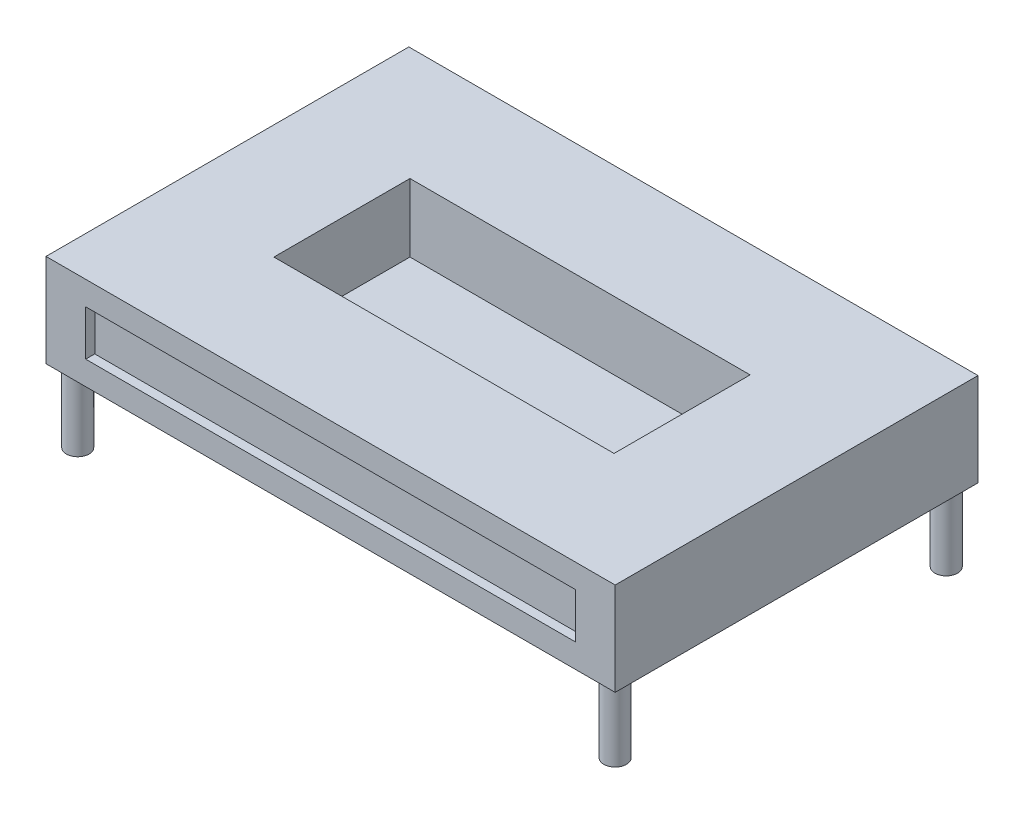
ISO-10303-21;
HEADER;
FILE_DESCRIPTION(('STEP AP214'),'2;1');
FILE_NAME('part.step','',(''),(''),'','','');
FILE_SCHEMA(('AUTOMOTIVE_DESIGN { 1 0 10303 214 1 1 1 1 }'));
ENDSEC;
DATA;
#1=APPLICATION_CONTEXT('core data for automotive mechanical design processes');
#2=APPLICATION_PROTOCOL_DEFINITION('international standard','automotive_design',2000,#1);
#3=PRODUCT_CONTEXT('',#1,'mechanical');
#4=PRODUCT('Part','Part','',(#3));
#5=PRODUCT_RELATED_PRODUCT_CATEGORY('part','',(#4));
#6=PRODUCT_DEFINITION_FORMATION('','',#4);
#7=PRODUCT_DEFINITION_CONTEXT('part definition',#1,'design');
#8=PRODUCT_DEFINITION('design','',#6,#7);
#9=PRODUCT_DEFINITION_SHAPE('','',#8);
#10=(LENGTH_UNIT() NAMED_UNIT(*) SI_UNIT(.MILLI.,.METRE.));
#11=(NAMED_UNIT(*) PLANE_ANGLE_UNIT() SI_UNIT($,.RADIAN.));
#12=(NAMED_UNIT(*) SI_UNIT($,.STERADIAN.) SOLID_ANGLE_UNIT());
#13=UNCERTAINTY_MEASURE_WITH_UNIT(LENGTH_MEASURE(1.E-05),#10,'distance_accuracy_value','');
#14=(GEOMETRIC_REPRESENTATION_CONTEXT(3) GLOBAL_UNCERTAINTY_ASSIGNED_CONTEXT((#13)) GLOBAL_UNIT_ASSIGNED_CONTEXT((#10,
#11,#12)) REPRESENTATION_CONTEXT('',''));
#15=CARTESIAN_POINT('',(0.,0.,0.));
#16=DIRECTION('',(0.,0.,1.));
#17=DIRECTION('',(1.,0.,0.));
#18=AXIS2_PLACEMENT_3D('',#15,#16,#17);
#19=CARTESIAN_POINT('',(-62.75,10.25,-40.));
#20=DIRECTION('',(0.,0.,1.));
#21=DIRECTION('',(1.,0.,0.));
#22=AXIS2_PLACEMENT_3D('',#19,#20,#21);
#23=PLANE('',#22);
#24=DIRECTION('',(-1.,0.,0.));
#25=VECTOR('',#24,1.);
#26=CARTESIAN_POINT('',(-62.75,-10.25,-40.));
#27=LINE('',#26,#25);
#28=CARTESIAN_POINT('',(62.75,-10.25,-40.));
#29=VERTEX_POINT('',#28);
#30=CARTESIAN_POINT('',(-62.75,-10.25,-40.));
#31=VERTEX_POINT('',#30);
#32=EDGE_CURVE('E337',#29,#31,#27,.T.);
#33=ORIENTED_EDGE('',*,*,#32,.T.);
#34=DIRECTION('',(0.,-1.,0.));
#35=VECTOR('',#34,1.);
#36=CARTESIAN_POINT('',(-62.75,10.25,-40.));
#37=LINE('',#36,#35);
#38=CARTESIAN_POINT('',(-62.75,10.25,-40.));
#39=VERTEX_POINT('',#38);
#40=EDGE_CURVE('E352',#39,#31,#37,.T.);
#41=ORIENTED_EDGE('',*,*,#40,.F.);
#42=DIRECTION('',(-1.,0.,0.));
#43=VECTOR('',#42,1.);
#44=CARTESIAN_POINT('',(-62.75,10.25,-40.));
#45=LINE('',#44,#43);
#46=CARTESIAN_POINT('',(62.75,10.25,-40.));
#47=VERTEX_POINT('',#46);
#48=EDGE_CURVE('E323',#47,#39,#45,.T.);
#49=ORIENTED_EDGE('',*,*,#48,.F.);
#50=DIRECTION('',(0.,-1.,0.));
#51=VECTOR('',#50,1.);
#52=CARTESIAN_POINT('',(62.75,10.25,-40.));
#53=LINE('',#52,#51);
#54=EDGE_CURVE('E356',#47,#29,#53,.T.);
#55=ORIENTED_EDGE('',*,*,#54,.T.);
#56=EDGE_LOOP('',(#33,#41,#49,#55));
#57=FACE_BOUND('',#56,.T.);
#58=DIRECTION('',(0.,1.,0.));
#59=VECTOR('',#58,1.);
#60=CARTESIAN_POINT('',(54.,-5.,-40.));
#61=LINE('',#60,#59);
#62=CARTESIAN_POINT('',(54.,-5.,-40.));
#63=VERTEX_POINT('',#62);
#64=CARTESIAN_POINT('',(54.,5.,-40.));
#65=VERTEX_POINT('',#64);
#66=EDGE_CURVE('E60',#63,#65,#61,.T.);
#67=ORIENTED_EDGE('',*,*,#66,.T.);
#68=DIRECTION('',(-1.,0.,0.));
#69=VECTOR('',#68,1.);
#70=CARTESIAN_POINT('',(-54.,5.,-40.));
#71=LINE('',#70,#69);
#72=CARTESIAN_POINT('',(-54.,5.,-40.));
#73=VERTEX_POINT('',#72);
#74=EDGE_CURVE('E181',#65,#73,#71,.T.);
#75=ORIENTED_EDGE('',*,*,#74,.T.);
#76=DIRECTION('',(0.,-1.,0.));
#77=VECTOR('',#76,1.);
#78=CARTESIAN_POINT('',(-54.,-5.,-40.));
#79=LINE('',#78,#77);
#80=CARTESIAN_POINT('',(-54.,-5.,-40.));
#81=VERTEX_POINT('',#80);
#82=EDGE_CURVE('E185',#73,#81,#79,.T.);
#83=ORIENTED_EDGE('',*,*,#82,.T.);
#84=DIRECTION('',(1.,0.,0.));
#85=VECTOR('',#84,1.);
#86=CARTESIAN_POINT('',(-54.,-5.,-40.));
#87=LINE('',#86,#85);
#88=EDGE_CURVE('E194',#81,#63,#87,.T.);
#89=ORIENTED_EDGE('',*,*,#88,.T.);
#90=EDGE_LOOP('',(#67,#75,#83,#89));
#91=FACE_BOUND('',#90,.T.);
#92=ADVANCED_FACE('F44',(#57,#91),#23,.F.);
#93=CARTESIAN_POINT('',(62.75,10.25,40.));
#94=DIRECTION('',(-1.,0.,0.));
#95=DIRECTION('',(0.,0.,1.));
#96=AXIS2_PLACEMENT_3D('',#93,#94,#95);
#97=PLANE('',#96);
#98=DIRECTION('',(0.,0.,-1.));
#99=VECTOR('',#98,1.);
#100=CARTESIAN_POINT('',(62.75,-10.25,40.));
#101=LINE('',#100,#99);
#102=CARTESIAN_POINT('',(62.75,-10.25,40.));
#103=VERTEX_POINT('',#102);
#104=EDGE_CURVE('E309',#103,#29,#101,.T.);
#105=ORIENTED_EDGE('',*,*,#104,.T.);
#106=ORIENTED_EDGE('',*,*,#54,.F.);
#107=DIRECTION('',(0.,0.,-1.));
#108=VECTOR('',#107,1.);
#109=CARTESIAN_POINT('',(62.75,10.25,40.));
#110=LINE('',#109,#108);
#111=CARTESIAN_POINT('',(62.75,10.25,40.));
#112=VERTEX_POINT('',#111);
#113=EDGE_CURVE('E319',#112,#47,#110,.T.);
#114=ORIENTED_EDGE('',*,*,#113,.F.);
#115=DIRECTION('',(0.,-1.,0.));
#116=VECTOR('',#115,1.);
#117=CARTESIAN_POINT('',(62.75,10.25,40.));
#118=LINE('',#117,#116);
#119=EDGE_CURVE('E333',#112,#103,#118,.T.);
#120=ORIENTED_EDGE('',*,*,#119,.T.);
#121=EDGE_LOOP('',(#105,#106,#114,#120));
#122=FACE_BOUND('',#121,.T.);
#123=ADVANCED_FACE('F46',(#122),#97,.F.);
#124=CARTESIAN_POINT('',(-62.75,10.25,40.));
#125=DIRECTION('',(1.,0.,0.));
#126=DIRECTION('',(0.,0.,-1.));
#127=AXIS2_PLACEMENT_3D('',#124,#125,#126);
#128=PLANE('',#127);
#129=DIRECTION('',(0.,0.,1.));
#130=VECTOR('',#129,1.);
#131=CARTESIAN_POINT('',(-62.75,-10.25,40.));
#132=LINE('',#131,#130);
#133=CARTESIAN_POINT('',(-62.75,-10.25,40.));
#134=VERTEX_POINT('',#133);
#135=EDGE_CURVE('E340',#31,#134,#132,.T.);
#136=ORIENTED_EDGE('',*,*,#135,.T.);
#137=DIRECTION('',(0.,-1.,0.));
#138=VECTOR('',#137,1.);
#139=CARTESIAN_POINT('',(-62.75,10.25,40.));
#140=LINE('',#139,#138);
#141=CARTESIAN_POINT('',(-62.75,10.25,40.));
#142=VERTEX_POINT('',#141);
#143=EDGE_CURVE('E348',#142,#134,#140,.T.);
#144=ORIENTED_EDGE('',*,*,#143,.F.);
#145=DIRECTION('',(0.,0.,1.));
#146=VECTOR('',#145,1.);
#147=CARTESIAN_POINT('',(-62.75,10.25,40.));
#148=LINE('',#147,#146);
#149=EDGE_CURVE('E327',#39,#142,#148,.T.);
#150=ORIENTED_EDGE('',*,*,#149,.F.);
#151=ORIENTED_EDGE('',*,*,#40,.T.);
#152=EDGE_LOOP('',(#136,#144,#150,#151));
#153=FACE_BOUND('',#152,.T.);
#154=ADVANCED_FACE('F387',(#153),#128,.F.);
#155=CARTESIAN_POINT('',(-62.75,10.25,40.));
#156=DIRECTION('',(0.,0.,-1.));
#157=DIRECTION('',(-1.,0.,0.));
#158=AXIS2_PLACEMENT_3D('',#155,#156,#157);
#159=PLANE('',#158);
#160=DIRECTION('',(-1.,0.,0.));
#161=VECTOR('',#160,1.);
#162=CARTESIAN_POINT('',(-54.,5.,40.));
#163=LINE('',#162,#161);
#164=CARTESIAN_POINT('',(54.,5.,40.));
#165=VERTEX_POINT('',#164);
#166=CARTESIAN_POINT('',(-54.,5.,40.));
#167=VERTEX_POINT('',#166);
#168=EDGE_CURVE('E228',#165,#167,#163,.T.);
#169=ORIENTED_EDGE('',*,*,#168,.F.);
#170=DIRECTION('',(0.,1.,0.));
#171=VECTOR('',#170,1.);
#172=CARTESIAN_POINT('',(54.,-5.,40.));
#173=LINE('',#172,#171);
#174=CARTESIAN_POINT('',(54.,-5.,40.));
#175=VERTEX_POINT('',#174);
#176=EDGE_CURVE('E68',#175,#165,#173,.T.);
#177=ORIENTED_EDGE('',*,*,#176,.F.);
#178=DIRECTION('',(1.,0.,0.));
#179=VECTOR('',#178,1.);
#180=CARTESIAN_POINT('',(-54.,-5.,40.));
#181=LINE('',#180,#179);
#182=CARTESIAN_POINT('',(-54.,-5.,40.));
#183=VERTEX_POINT('',#182);
#184=EDGE_CURVE('E213',#183,#175,#181,.T.);
#185=ORIENTED_EDGE('',*,*,#184,.F.);
#186=DIRECTION('',(0.,-1.,0.));
#187=VECTOR('',#186,1.);
#188=CARTESIAN_POINT('',(-54.,-5.,40.));
#189=LINE('',#188,#187);
#190=EDGE_CURVE('E232',#167,#183,#189,.T.);
#191=ORIENTED_EDGE('',*,*,#190,.F.);
#192=EDGE_LOOP('',(#169,#177,#185,#191));
#193=FACE_BOUND('',#192,.T.);
#194=DIRECTION('',(1.,0.,0.));
#195=VECTOR('',#194,1.);
#196=CARTESIAN_POINT('',(-62.75,-10.25,40.));
#197=LINE('',#196,#195);
#198=EDGE_CURVE('E324',#134,#103,#197,.T.);
#199=ORIENTED_EDGE('',*,*,#198,.T.);
#200=ORIENTED_EDGE('',*,*,#119,.F.);
#201=DIRECTION('',(1.,0.,0.));
#202=VECTOR('',#201,1.);
#203=CARTESIAN_POINT('',(-62.75,10.25,40.));
#204=LINE('',#203,#202);
#205=EDGE_CURVE('E330',#142,#112,#204,.T.);
#206=ORIENTED_EDGE('',*,*,#205,.F.);
#207=ORIENTED_EDGE('',*,*,#143,.T.);
#208=EDGE_LOOP('',(#199,#200,#206,#207));
#209=FACE_BOUND('',#208,.T.);
#210=ADVANCED_FACE('F383',(#193,#209),#159,.F.);
#211=CARTESIAN_POINT('',(0.,10.25,0.));
#212=DIRECTION('',(0.,-1.,0.));
#213=DIRECTION('',(0.,0.,-1.));
#214=AXIS2_PLACEMENT_3D('',#211,#212,#213);
#215=PLANE('',#214);
#216=DIRECTION('',(-1.,0.,0.));
#217=VECTOR('',#216,1.);
#218=CARTESIAN_POINT('',(-37.5,10.25,-15.));
#219=LINE('',#218,#217);
#220=CARTESIAN_POINT('',(37.5,10.25,-15.));
#221=VERTEX_POINT('',#220);
#222=CARTESIAN_POINT('',(-37.5,10.25,-15.));
#223=VERTEX_POINT('',#222);
#224=EDGE_CURVE('E295',#221,#223,#219,.T.);
#225=ORIENTED_EDGE('',*,*,#224,.F.);
#226=DIRECTION('',(0.,0.,-1.));
#227=VECTOR('',#226,1.);
#228=CARTESIAN_POINT('',(37.5,10.25,15.));
#229=LINE('',#228,#227);
#230=CARTESIAN_POINT('',(37.5,10.25,15.));
#231=VERTEX_POINT('',#230);
#232=EDGE_CURVE('E271',#231,#221,#229,.T.);
#233=ORIENTED_EDGE('',*,*,#232,.F.);
#234=DIRECTION('',(1.,0.,0.));
#235=VECTOR('',#234,1.);
#236=CARTESIAN_POINT('',(-37.5,10.25,15.));
#237=LINE('',#236,#235);
#238=CARTESIAN_POINT('',(-37.5,10.25,15.));
#239=VERTEX_POINT('',#238);
#240=EDGE_CURVE('E280',#239,#231,#237,.T.);
#241=ORIENTED_EDGE('',*,*,#240,.F.);
#242=DIRECTION('',(0.,0.,1.));
#243=VECTOR('',#242,1.);
#244=CARTESIAN_POINT('',(-37.5,10.25,15.));
#245=LINE('',#244,#243);
#246=EDGE_CURVE('E299',#223,#239,#245,.T.);
#247=ORIENTED_EDGE('',*,*,#246,.F.);
#248=EDGE_LOOP('',(#225,#233,#241,#247));
#249=FACE_BOUND('',#248,.T.);
#250=ORIENTED_EDGE('',*,*,#113,.T.);
#251=ORIENTED_EDGE('',*,*,#48,.T.);
#252=ORIENTED_EDGE('',*,*,#149,.T.);
#253=ORIENTED_EDGE('',*,*,#205,.T.);
#254=EDGE_LOOP('',(#250,#251,#252,#253));
#255=FACE_BOUND('',#254,.T.);
#256=ADVANCED_FACE('F369',(#249,#255),#215,.F.);
#257=CARTESIAN_POINT('',(0.,-10.25,0.));
#258=DIRECTION('',(0.,-1.,0.));
#259=DIRECTION('',(0.,0.,-1.));
#260=AXIS2_PLACEMENT_3D('',#257,#258,#259);
#261=PLANE('',#260);
#262=CARTESIAN_POINT('',(-59.25,-10.25,-36.5));
#263=DIRECTION('',(0.,-1.,0.));
#264=DIRECTION('',(0.,0.,1.));
#265=AXIS2_PLACEMENT_3D('',#262,#263,#264);
#266=CIRCLE('',#265,2.5);
#267=CARTESIAN_POINT('',(-59.25,-10.25,-34.));
#268=VERTEX_POINT('',#267);
#269=EDGE_CURVE('E242',#268,#268,#266,.T.);
#270=ORIENTED_EDGE('',*,*,#269,.F.);
#271=EDGE_LOOP('',(#270));
#272=FACE_BOUND('',#271,.T.);
#273=CARTESIAN_POINT('',(-59.25,-10.25,36.5));
#274=DIRECTION('',(0.,-1.,0.));
#275=DIRECTION('',(0.,0.,-1.));
#276=AXIS2_PLACEMENT_3D('',#273,#274,#275);
#277=CIRCLE('',#276,2.5);
#278=CARTESIAN_POINT('',(-59.25,-10.25,34.));
#279=VERTEX_POINT('',#278);
#280=EDGE_CURVE('E11',#279,#279,#277,.T.);
#281=ORIENTED_EDGE('',*,*,#280,.F.);
#282=EDGE_LOOP('',(#281));
#283=FACE_BOUND('',#282,.T.);
#284=CARTESIAN_POINT('',(59.25,-10.25,-36.5));
#285=DIRECTION('',(0.,-1.,0.));
#286=DIRECTION('',(0.,0.,-1.));
#287=AXIS2_PLACEMENT_3D('',#284,#285,#286);
#288=CIRCLE('',#287,2.5);
#289=CARTESIAN_POINT('',(59.25,-10.25,-39.));
#290=VERTEX_POINT('',#289);
#291=EDGE_CURVE('E53',#290,#290,#288,.T.);
#292=ORIENTED_EDGE('',*,*,#291,.F.);
#293=EDGE_LOOP('',(#292));
#294=FACE_BOUND('',#293,.T.);
#295=CARTESIAN_POINT('',(59.25,-10.25,36.5));
#296=DIRECTION('',(0.,-1.,0.));
#297=DIRECTION('',(0.,0.,-1.));
#298=AXIS2_PLACEMENT_3D('',#295,#296,#297);
#299=CIRCLE('',#298,2.5);
#300=CARTESIAN_POINT('',(59.25,-10.25,34.));
#301=VERTEX_POINT('',#300);
#302=EDGE_CURVE('E266',#301,#301,#299,.T.);
#303=ORIENTED_EDGE('',*,*,#302,.F.);
#304=EDGE_LOOP('',(#303));
#305=FACE_BOUND('',#304,.T.);
#306=ORIENTED_EDGE('',*,*,#104,.F.);
#307=ORIENTED_EDGE('',*,*,#198,.F.);
#308=ORIENTED_EDGE('',*,*,#135,.F.);
#309=ORIENTED_EDGE('',*,*,#32,.F.);
#310=EDGE_LOOP('',(#306,#307,#308,#309));
#311=FACE_BOUND('',#310,.T.);
#312=ADVANCED_FACE('F365',(#272,#283,#294,#305,#311),#261,.T.);
#313=CARTESIAN_POINT('',(37.5,-4.75,15.));
#314=DIRECTION('',(1.,0.,0.));
#315=DIRECTION('',(0.,0.,-1.));
#316=AXIS2_PLACEMENT_3D('',#313,#314,#315);
#317=PLANE('',#316);
#318=ORIENTED_EDGE('',*,*,#232,.T.);
#319=DIRECTION('',(0.,1.,0.));
#320=VECTOR('',#319,1.);
#321=CARTESIAN_POINT('',(37.5,-4.75,-15.));
#322=LINE('',#321,#320);
#323=CARTESIAN_POINT('',(37.5,-4.75,-15.));
#324=VERTEX_POINT('',#323);
#325=EDGE_CURVE('E292',#324,#221,#322,.T.);
#326=ORIENTED_EDGE('',*,*,#325,.F.);
#327=DIRECTION('',(0.,0.,-1.));
#328=VECTOR('',#327,1.);
#329=CARTESIAN_POINT('',(37.5,-4.75,15.));
#330=LINE('',#329,#328);
#331=CARTESIAN_POINT('',(37.5,-4.75,15.));
#332=VERTEX_POINT('',#331);
#333=EDGE_CURVE('E275',#332,#324,#330,.T.);
#334=ORIENTED_EDGE('',*,*,#333,.F.);
#335=DIRECTION('',(0.,1.,0.));
#336=VECTOR('',#335,1.);
#337=CARTESIAN_POINT('',(37.5,-4.75,15.));
#338=LINE('',#337,#336);
#339=EDGE_CURVE('E306',#332,#231,#338,.T.);
#340=ORIENTED_EDGE('',*,*,#339,.T.);
#341=EDGE_LOOP('',(#318,#326,#334,#340));
#342=FACE_BOUND('',#341,.T.);
#343=ADVANCED_FACE('F368',(#342),#317,.F.);
#344=CARTESIAN_POINT('',(-37.5,-4.75,15.));
#345=DIRECTION('',(0.,0.,1.));
#346=DIRECTION('',(1.,0.,0.));
#347=AXIS2_PLACEMENT_3D('',#344,#345,#346);
#348=PLANE('',#347);
#349=ORIENTED_EDGE('',*,*,#240,.T.);
#350=ORIENTED_EDGE('',*,*,#339,.F.);
#351=DIRECTION('',(1.,0.,0.));
#352=VECTOR('',#351,1.);
#353=CARTESIAN_POINT('',(-37.5,-4.75,15.));
#354=LINE('',#353,#352);
#355=CARTESIAN_POINT('',(-37.5,-4.75,15.));
#356=VERTEX_POINT('',#355);
#357=EDGE_CURVE('E288',#356,#332,#354,.T.);
#358=ORIENTED_EDGE('',*,*,#357,.F.);
#359=DIRECTION('',(0.,1.,0.));
#360=VECTOR('',#359,1.);
#361=CARTESIAN_POINT('',(-37.5,-4.75,15.));
#362=LINE('',#361,#360);
#363=EDGE_CURVE('E310',#356,#239,#362,.T.);
#364=ORIENTED_EDGE('',*,*,#363,.T.);
#365=EDGE_LOOP('',(#349,#350,#358,#364));
#366=FACE_BOUND('',#365,.T.);
#367=ADVANCED_FACE('F441',(#366),#348,.F.);
#368=CARTESIAN_POINT('',(-37.5,-4.75,15.));
#369=DIRECTION('',(-1.,0.,0.));
#370=DIRECTION('',(0.,0.,1.));
#371=AXIS2_PLACEMENT_3D('',#368,#369,#370);
#372=PLANE('',#371);
#373=ORIENTED_EDGE('',*,*,#246,.T.);
#374=ORIENTED_EDGE('',*,*,#363,.F.);
#375=DIRECTION('',(0.,0.,1.));
#376=VECTOR('',#375,1.);
#377=CARTESIAN_POINT('',(-37.5,-4.75,15.));
#378=LINE('',#377,#376);
#379=CARTESIAN_POINT('',(-37.5,-4.75,-15.));
#380=VERTEX_POINT('',#379);
#381=EDGE_CURVE('E284',#380,#356,#378,.T.);
#382=ORIENTED_EDGE('',*,*,#381,.F.);
#383=DIRECTION('',(0.,1.,0.));
#384=VECTOR('',#383,1.);
#385=CARTESIAN_POINT('',(-37.5,-4.75,-15.));
#386=LINE('',#385,#384);
#387=EDGE_CURVE('E313',#380,#223,#386,.T.);
#388=ORIENTED_EDGE('',*,*,#387,.T.);
#389=EDGE_LOOP('',(#373,#374,#382,#388));
#390=FACE_BOUND('',#389,.T.);
#391=ADVANCED_FACE('F449',(#390),#372,.F.);
#392=CARTESIAN_POINT('',(-37.5,-4.75,-15.));
#393=DIRECTION('',(0.,0.,-1.));
#394=DIRECTION('',(-1.,0.,0.));
#395=AXIS2_PLACEMENT_3D('',#392,#393,#394);
#396=PLANE('',#395);
#397=ORIENTED_EDGE('',*,*,#224,.T.);
#398=ORIENTED_EDGE('',*,*,#387,.F.);
#399=DIRECTION('',(-1.,0.,0.));
#400=VECTOR('',#399,1.);
#401=CARTESIAN_POINT('',(-37.5,-4.75,-15.));
#402=LINE('',#401,#400);
#403=EDGE_CURVE('E279',#324,#380,#402,.T.);
#404=ORIENTED_EDGE('',*,*,#403,.F.);
#405=ORIENTED_EDGE('',*,*,#325,.T.);
#406=EDGE_LOOP('',(#397,#398,#404,#405));
#407=FACE_BOUND('',#406,.T.);
#408=ADVANCED_FACE('F458',(#407),#396,.F.);
#409=CARTESIAN_POINT('',(0.,-4.75,0.));
#410=DIRECTION('',(0.,-1.,0.));
#411=DIRECTION('',(0.,0.,-1.));
#412=AXIS2_PLACEMENT_3D('',#409,#410,#411);
#413=PLANE('',#412);
#414=ORIENTED_EDGE('',*,*,#333,.T.);
#415=ORIENTED_EDGE('',*,*,#403,.T.);
#416=ORIENTED_EDGE('',*,*,#381,.T.);
#417=ORIENTED_EDGE('',*,*,#357,.T.);
#418=EDGE_LOOP('',(#414,#415,#416,#417));
#419=FACE_BOUND('',#418,.T.);
#420=ADVANCED_FACE('F467',(#419),#413,.F.);
#421=CARTESIAN_POINT('',(59.25,-26.25,36.5));
#422=DIRECTION('',(0.,1.,0.));
#423=DIRECTION('',(0.,0.,1.));
#424=AXIS2_PLACEMENT_3D('',#421,#422,#423);
#425=CYLINDRICAL_SURFACE('',#424,2.5);
#426=CARTESIAN_POINT('',(59.25,-26.25,36.5));
#427=DIRECTION('',(0.,-1.,0.));
#428=DIRECTION('',(0.,0.,-1.));
#429=AXIS2_PLACEMENT_3D('',#426,#427,#428);
#430=CIRCLE('',#429,2.5);
#431=CARTESIAN_POINT('',(59.25,-26.25,34.));
#432=VERTEX_POINT('',#431);
#433=EDGE_CURVE('E267',#432,#432,#430,.T.);
#434=ORIENTED_EDGE('',*,*,#433,.F.);
#435=EDGE_LOOP('',(#434));
#436=FACE_BOUND('',#435,.T.);
#437=ORIENTED_EDGE('',*,*,#302,.T.);
#438=EDGE_LOOP('',(#437));
#439=FACE_BOUND('',#438,.T.);
#440=ADVANCED_FACE('F476',(#436,#439),#425,.T.);
#441=CARTESIAN_POINT('',(59.25,-26.25,36.5));
#442=DIRECTION('',(0.,-1.,0.));
#443=DIRECTION('',(0.,0.,-1.));
#444=AXIS2_PLACEMENT_3D('',#441,#442,#443);
#445=PLANE('',#444);
#446=ORIENTED_EDGE('',*,*,#433,.T.);
#447=EDGE_LOOP('',(#446));
#448=FACE_BOUND('',#447,.T.);
#449=ADVANCED_FACE('F485',(#448),#445,.T.);
#450=CARTESIAN_POINT('',(59.25,-26.25,-36.5));
#451=DIRECTION('',(0.,1.,0.));
#452=DIRECTION('',(0.,0.,1.));
#453=AXIS2_PLACEMENT_3D('',#450,#451,#452);
#454=CYLINDRICAL_SURFACE('',#453,2.5);
#455=CARTESIAN_POINT('',(59.25,-26.25,-36.5));
#456=DIRECTION('',(0.,1.,0.));
#457=DIRECTION('',(0.,0.,1.));
#458=AXIS2_PLACEMENT_3D('',#455,#456,#457);
#459=CIRCLE('',#458,2.5);
#460=CARTESIAN_POINT('',(59.25,-26.25,-34.));
#461=VERTEX_POINT('',#460);
#462=EDGE_CURVE('E262',#461,#461,#459,.T.);
#463=ORIENTED_EDGE('',*,*,#462,.T.);
#464=EDGE_LOOP('',(#463));
#465=FACE_BOUND('',#464,.T.);
#466=ORIENTED_EDGE('',*,*,#291,.T.);
#467=EDGE_LOOP('',(#466));
#468=FACE_BOUND('',#467,.T.);
#469=ADVANCED_FACE('F363',(#465,#468),#454,.T.);
#470=CARTESIAN_POINT('',(59.25,-26.25,-36.5));
#471=DIRECTION('',(0.,-1.,0.));
#472=DIRECTION('',(0.,0.,1.));
#473=AXIS2_PLACEMENT_3D('',#470,#471,#472);
#474=PLANE('',#473);
#475=ORIENTED_EDGE('',*,*,#462,.F.);
#476=EDGE_LOOP('',(#475));
#477=FACE_BOUND('',#476,.T.);
#478=ADVANCED_FACE('F502',(#477),#474,.T.);
#479=CARTESIAN_POINT('',(-59.25,-26.25,36.5));
#480=DIRECTION('',(0.,1.,0.));
#481=DIRECTION('',(0.,0.,1.));
#482=AXIS2_PLACEMENT_3D('',#479,#480,#481);
#483=CYLINDRICAL_SURFACE('',#482,2.5);
#484=CARTESIAN_POINT('',(-59.25,-26.25,36.5));
#485=DIRECTION('',(0.,1.,0.));
#486=DIRECTION('',(0.,0.,-1.));
#487=AXIS2_PLACEMENT_3D('',#484,#485,#486);
#488=CIRCLE('',#487,2.5);
#489=CARTESIAN_POINT('',(-59.25,-26.25,34.));
#490=VERTEX_POINT('',#489);
#491=EDGE_CURVE('E255',#490,#490,#488,.T.);
#492=ORIENTED_EDGE('',*,*,#491,.T.);
#493=EDGE_LOOP('',(#492));
#494=FACE_BOUND('',#493,.T.);
#495=ORIENTED_EDGE('',*,*,#280,.T.);
#496=EDGE_LOOP('',(#495));
#497=FACE_BOUND('',#496,.T.);
#498=ADVANCED_FACE('F511',(#494,#497),#483,.T.);
#499=CARTESIAN_POINT('',(-59.25,-26.25,36.5));
#500=DIRECTION('',(0.,-1.,0.));
#501=DIRECTION('',(0.,0.,-1.));
#502=AXIS2_PLACEMENT_3D('',#499,#500,#501);
#503=PLANE('',#502);
#504=ORIENTED_EDGE('',*,*,#491,.F.);
#505=EDGE_LOOP('',(#504));
#506=FACE_BOUND('',#505,.T.);
#507=ADVANCED_FACE('F520',(#506),#503,.T.);
#508=CARTESIAN_POINT('',(-59.25,-26.25,-36.5));
#509=DIRECTION('',(0.,1.,0.));
#510=DIRECTION('',(0.,0.,1.));
#511=AXIS2_PLACEMENT_3D('',#508,#509,#510);
#512=CYLINDRICAL_SURFACE('',#511,2.5);
#513=CARTESIAN_POINT('',(-59.25,-26.25,-36.5));
#514=DIRECTION('',(0.,-1.,0.));
#515=DIRECTION('',(0.,0.,1.));
#516=AXIS2_PLACEMENT_3D('',#513,#514,#515);
#517=CIRCLE('',#516,2.5);
#518=CARTESIAN_POINT('',(-59.25,-26.25,-34.));
#519=VERTEX_POINT('',#518);
#520=EDGE_CURVE('E251',#519,#519,#517,.T.);
#521=ORIENTED_EDGE('',*,*,#520,.F.);
#522=EDGE_LOOP('',(#521));
#523=FACE_BOUND('',#522,.T.);
#524=ORIENTED_EDGE('',*,*,#269,.T.);
#525=EDGE_LOOP('',(#524));
#526=FACE_BOUND('',#525,.T.);
#527=ADVANCED_FACE('F529',(#523,#526),#512,.T.);
#528=CARTESIAN_POINT('',(-59.25,-26.25,-36.5));
#529=DIRECTION('',(0.,-1.,0.));
#530=DIRECTION('',(0.,0.,1.));
#531=AXIS2_PLACEMENT_3D('',#528,#529,#530);
#532=PLANE('',#531);
#533=ORIENTED_EDGE('',*,*,#520,.T.);
#534=EDGE_LOOP('',(#533));
#535=FACE_BOUND('',#534,.T.);
#536=ADVANCED_FACE('F538',(#535),#532,.T.);
#537=CARTESIAN_POINT('',(54.,-5.,38.));
#538=DIRECTION('',(1.,0.,0.));
#539=DIRECTION('',(0.,1.,0.));
#540=AXIS2_PLACEMENT_3D('',#537,#538,#539);
#541=PLANE('',#540);
#542=ORIENTED_EDGE('',*,*,#176,.T.);
#543=DIRECTION('',(0.,0.,1.));
#544=VECTOR('',#543,1.);
#545=CARTESIAN_POINT('',(54.,5.,38.));
#546=LINE('',#545,#544);
#547=CARTESIAN_POINT('',(54.,5.,38.));
#548=VERTEX_POINT('',#547);
#549=EDGE_CURVE('E225',#548,#165,#546,.T.);
#550=ORIENTED_EDGE('',*,*,#549,.F.);
#551=DIRECTION('',(0.,1.,0.));
#552=VECTOR('',#551,1.);
#553=CARTESIAN_POINT('',(54.,-5.,38.));
#554=LINE('',#553,#552);
#555=CARTESIAN_POINT('',(54.,-5.,38.));
#556=VERTEX_POINT('',#555);
#557=EDGE_CURVE('E208',#556,#548,#554,.T.);
#558=ORIENTED_EDGE('',*,*,#557,.F.);
#559=DIRECTION('',(0.,0.,1.));
#560=VECTOR('',#559,1.);
#561=CARTESIAN_POINT('',(54.,-5.,38.));
#562=LINE('',#561,#560);
#563=EDGE_CURVE('E239',#556,#175,#562,.T.);
#564=ORIENTED_EDGE('',*,*,#563,.T.);
#565=EDGE_LOOP('',(#542,#550,#558,#564));
#566=FACE_BOUND('',#565,.T.);
#567=ADVANCED_FACE('F547',(#566),#541,.F.);
#568=CARTESIAN_POINT('',(-54.,-5.,38.));
#569=DIRECTION('',(0.,-1.,0.));
#570=DIRECTION('',(0.,0.,-1.));
#571=AXIS2_PLACEMENT_3D('',#568,#569,#570);
#572=PLANE('',#571);
#573=ORIENTED_EDGE('',*,*,#184,.T.);
#574=ORIENTED_EDGE('',*,*,#563,.F.);
#575=DIRECTION('',(1.,0.,0.));
#576=VECTOR('',#575,1.);
#577=CARTESIAN_POINT('',(-54.,-5.,38.));
#578=LINE('',#577,#576);
#579=CARTESIAN_POINT('',(-54.,-5.,38.));
#580=VERTEX_POINT('',#579);
#581=EDGE_CURVE('E221',#580,#556,#578,.T.);
#582=ORIENTED_EDGE('',*,*,#581,.F.);
#583=DIRECTION('',(0.,0.,1.));
#584=VECTOR('',#583,1.);
#585=CARTESIAN_POINT('',(-54.,-5.,38.));
#586=LINE('',#585,#584);
#587=EDGE_CURVE('E243',#580,#183,#586,.T.);
#588=ORIENTED_EDGE('',*,*,#587,.T.);
#589=EDGE_LOOP('',(#573,#574,#582,#588));
#590=FACE_BOUND('',#589,.T.);
#591=ADVANCED_FACE('F556',(#590),#572,.F.);
#592=CARTESIAN_POINT('',(-54.,-5.,38.));
#593=DIRECTION('',(-1.,0.,0.));
#594=DIRECTION('',(0.,0.,1.));
#595=AXIS2_PLACEMENT_3D('',#592,#593,#594);
#596=PLANE('',#595);
#597=ORIENTED_EDGE('',*,*,#190,.T.);
#598=ORIENTED_EDGE('',*,*,#587,.F.);
#599=DIRECTION('',(0.,-1.,0.));
#600=VECTOR('',#599,1.);
#601=CARTESIAN_POINT('',(-54.,-5.,38.));
#602=LINE('',#601,#600);
#603=CARTESIAN_POINT('',(-54.,5.,38.));
#604=VERTEX_POINT('',#603);
#605=EDGE_CURVE('E217',#604,#580,#602,.T.);
#606=ORIENTED_EDGE('',*,*,#605,.F.);
#607=DIRECTION('',(0.,0.,1.));
#608=VECTOR('',#607,1.);
#609=CARTESIAN_POINT('',(-54.,5.,38.));
#610=LINE('',#609,#608);
#611=EDGE_CURVE('E246',#604,#167,#610,.T.);
#612=ORIENTED_EDGE('',*,*,#611,.T.);
#613=EDGE_LOOP('',(#597,#598,#606,#612));
#614=FACE_BOUND('',#613,.T.);
#615=ADVANCED_FACE('F564',(#614),#596,.F.);
#616=CARTESIAN_POINT('',(-54.,5.,38.));
#617=DIRECTION('',(0.,1.,0.));
#618=DIRECTION('',(-1.,0.,0.));
#619=AXIS2_PLACEMENT_3D('',#616,#617,#618);
#620=PLANE('',#619);
#621=ORIENTED_EDGE('',*,*,#168,.T.);
#622=ORIENTED_EDGE('',*,*,#611,.F.);
#623=DIRECTION('',(-1.,0.,0.));
#624=VECTOR('',#623,1.);
#625=CARTESIAN_POINT('',(-54.,5.,38.));
#626=LINE('',#625,#624);
#627=EDGE_CURVE('E212',#548,#604,#626,.T.);
#628=ORIENTED_EDGE('',*,*,#627,.F.);
#629=ORIENTED_EDGE('',*,*,#549,.T.);
#630=EDGE_LOOP('',(#621,#622,#628,#629));
#631=FACE_BOUND('',#630,.T.);
#632=ADVANCED_FACE('F573',(#631),#620,.F.);
#633=CARTESIAN_POINT('',(0.,0.,38.));
#634=DIRECTION('',(0.,0.,-1.));
#635=DIRECTION('',(-1.,0.,0.));
#636=AXIS2_PLACEMENT_3D('',#633,#634,#635);
#637=PLANE('',#636);
#638=ORIENTED_EDGE('',*,*,#557,.T.);
#639=ORIENTED_EDGE('',*,*,#627,.T.);
#640=ORIENTED_EDGE('',*,*,#605,.T.);
#641=ORIENTED_EDGE('',*,*,#581,.T.);
#642=EDGE_LOOP('',(#638,#639,#640,#641));
#643=FACE_BOUND('',#642,.T.);
#644=ADVANCED_FACE('F582',(#643),#637,.F.);
#645=CARTESIAN_POINT('',(54.,-5.,-38.));
#646=DIRECTION('',(-1.,0.,0.));
#647=DIRECTION('',(0.,-1.,0.));
#648=AXIS2_PLACEMENT_3D('',#645,#646,#647);
#649=PLANE('',#648);
#650=ORIENTED_EDGE('',*,*,#66,.F.);
#651=DIRECTION('',(0.,0.,-1.));
#652=VECTOR('',#651,1.);
#653=CARTESIAN_POINT('',(54.,-5.,-38.));
#654=LINE('',#653,#652);
#655=CARTESIAN_POINT('',(54.,-5.,-38.));
#656=VERTEX_POINT('',#655);
#657=EDGE_CURVE('E163',#656,#63,#654,.T.);
#658=ORIENTED_EDGE('',*,*,#657,.F.);
#659=DIRECTION('',(0.,1.,0.));
#660=VECTOR('',#659,1.);
#661=CARTESIAN_POINT('',(54.,-5.,-38.));
#662=LINE('',#661,#660);
#663=CARTESIAN_POINT('',(54.,5.,-38.));
#664=VERTEX_POINT('',#663);
#665=EDGE_CURVE('E171',#656,#664,#662,.T.);
#666=ORIENTED_EDGE('',*,*,#665,.T.);
#667=DIRECTION('',(0.,0.,-1.));
#668=VECTOR('',#667,1.);
#669=CARTESIAN_POINT('',(54.,5.,-38.));
#670=LINE('',#669,#668);
#671=EDGE_CURVE('E200',#664,#65,#670,.T.);
#672=ORIENTED_EDGE('',*,*,#671,.T.);
#673=EDGE_LOOP('',(#650,#658,#666,#672));
#674=FACE_BOUND('',#673,.T.);
#675=ADVANCED_FACE('F174',(#674),#649,.T.);
#676=CARTESIAN_POINT('',(-54.,5.,-38.));
#677=DIRECTION('',(0.,-1.,0.));
#678=DIRECTION('',(1.,0.,0.));
#679=AXIS2_PLACEMENT_3D('',#676,#677,#678);
#680=PLANE('',#679);
#681=ORIENTED_EDGE('',*,*,#74,.F.);
#682=ORIENTED_EDGE('',*,*,#671,.F.);
#683=DIRECTION('',(-1.,0.,0.));
#684=VECTOR('',#683,1.);
#685=CARTESIAN_POINT('',(-54.,5.,-38.));
#686=LINE('',#685,#684);
#687=CARTESIAN_POINT('',(-54.,5.,-38.));
#688=VERTEX_POINT('',#687);
#689=EDGE_CURVE('E177',#664,#688,#686,.T.);
#690=ORIENTED_EDGE('',*,*,#689,.T.);
#691=DIRECTION('',(0.,0.,-1.));
#692=VECTOR('',#691,1.);
#693=CARTESIAN_POINT('',(-54.,5.,-38.));
#694=LINE('',#693,#692);
#695=EDGE_CURVE('E203',#688,#73,#694,.T.);
#696=ORIENTED_EDGE('',*,*,#695,.T.);
#697=EDGE_LOOP('',(#681,#682,#690,#696));
#698=FACE_BOUND('',#697,.T.);
#699=ADVANCED_FACE('F601',(#698),#680,.T.);
#700=CARTESIAN_POINT('',(-54.,-5.,-38.));
#701=DIRECTION('',(1.,0.,0.));
#702=DIRECTION('',(0.,0.,-1.));
#703=AXIS2_PLACEMENT_3D('',#700,#701,#702);
#704=PLANE('',#703);
#705=ORIENTED_EDGE('',*,*,#82,.F.);
#706=ORIENTED_EDGE('',*,*,#695,.F.);
#707=DIRECTION('',(0.,-1.,0.));
#708=VECTOR('',#707,1.);
#709=CARTESIAN_POINT('',(-54.,-5.,-38.));
#710=LINE('',#709,#708);
#711=CARTESIAN_POINT('',(-54.,-5.,-38.));
#712=VERTEX_POINT('',#711);
#713=EDGE_CURVE('E170',#688,#712,#710,.T.);
#714=ORIENTED_EDGE('',*,*,#713,.T.);
#715=DIRECTION('',(0.,0.,-1.));
#716=VECTOR('',#715,1.);
#717=CARTESIAN_POINT('',(-54.,-5.,-38.));
#718=LINE('',#717,#716);
#719=EDGE_CURVE('E165',#712,#81,#718,.T.);
#720=ORIENTED_EDGE('',*,*,#719,.T.);
#721=EDGE_LOOP('',(#705,#706,#714,#720));
#722=FACE_BOUND('',#721,.T.);
#723=ADVANCED_FACE('F609',(#722),#704,.T.);
#724=CARTESIAN_POINT('',(-54.,-5.,-38.));
#725=DIRECTION('',(0.,1.,0.));
#726=DIRECTION('',(0.,0.,1.));
#727=AXIS2_PLACEMENT_3D('',#724,#725,#726);
#728=PLANE('',#727);
#729=ORIENTED_EDGE('',*,*,#88,.F.);
#730=ORIENTED_EDGE('',*,*,#719,.F.);
#731=DIRECTION('',(1.,0.,0.));
#732=VECTOR('',#731,1.);
#733=CARTESIAN_POINT('',(-54.,-5.,-38.));
#734=LINE('',#733,#732);
#735=EDGE_CURVE('E160',#712,#656,#734,.T.);
#736=ORIENTED_EDGE('',*,*,#735,.T.);
#737=ORIENTED_EDGE('',*,*,#657,.T.);
#738=EDGE_LOOP('',(#729,#730,#736,#737));
#739=FACE_BOUND('',#738,.T.);
#740=ADVANCED_FACE('F162',(#739),#728,.T.);
#741=CARTESIAN_POINT('',(0.,0.,-38.));
#742=DIRECTION('',(0.,0.,1.));
#743=DIRECTION('',(-1.,0.,0.));
#744=AXIS2_PLACEMENT_3D('',#741,#742,#743);
#745=PLANE('',#744);
#746=ORIENTED_EDGE('',*,*,#665,.F.);
#747=ORIENTED_EDGE('',*,*,#735,.F.);
#748=ORIENTED_EDGE('',*,*,#713,.F.);
#749=ORIENTED_EDGE('',*,*,#689,.F.);
#750=EDGE_LOOP('',(#746,#747,#748,#749));
#751=FACE_BOUND('',#750,.T.);
#752=ADVANCED_FACE('F179',(#751),#745,.F.);
#753=CLOSED_SHELL('',(#92,#123,#154,#210,#256,#312,#343,#367,#391,#408,#420,#440,#449,#469,#478,
#498,#507,#527,#536,#567,#591,#615,#632,#644,#675,#699,#723,#740,#752));
#754=MANIFOLD_SOLID_BREP('B2',#753);
#755=ADVANCED_BREP_SHAPE_REPRESENTATION('',(#18,#754),#14);
#756=SHAPE_DEFINITION_REPRESENTATION(#9,#755);
ENDSEC;
END-ISO-10303-21;
